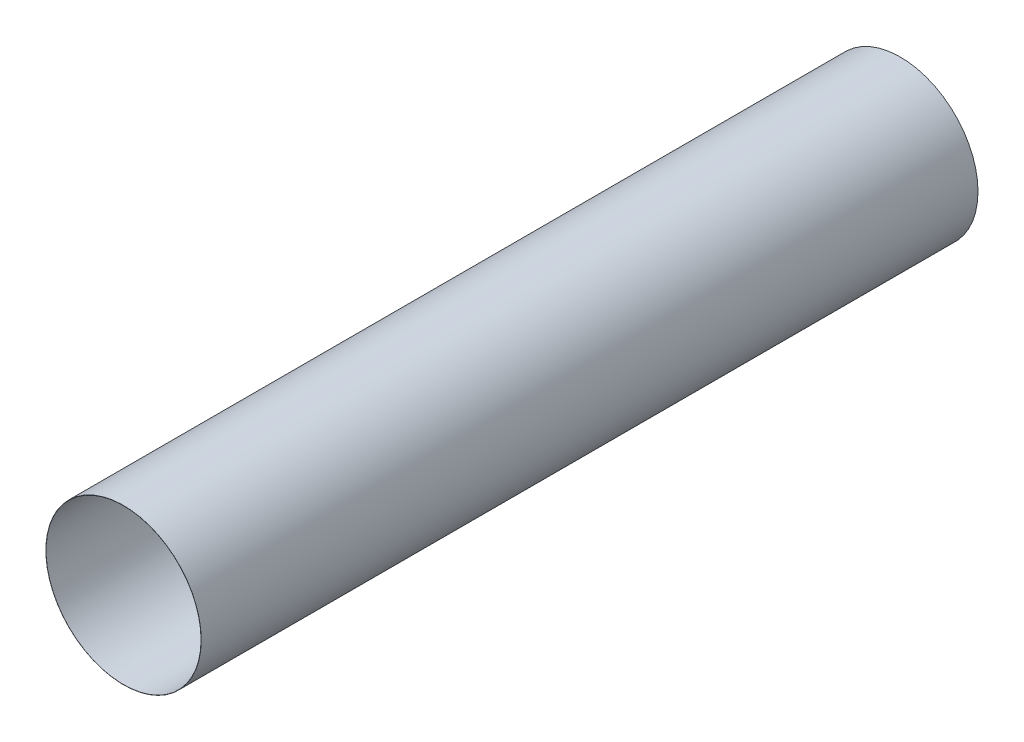
ISO-10303-21;
HEADER;
FILE_DESCRIPTION(('STEP AP214'),'2;1');
FILE_NAME('part.step','',(''),(''),'','','');
FILE_SCHEMA(('AUTOMOTIVE_DESIGN { 1 0 10303 214 1 1 1 1 }'));
ENDSEC;
DATA;
#1=APPLICATION_CONTEXT('core data for automotive mechanical design processes');
#2=APPLICATION_PROTOCOL_DEFINITION('international standard','automotive_design',2000,#1);
#3=PRODUCT_CONTEXT('',#1,'mechanical');
#4=PRODUCT('Part','Part','',(#3));
#5=PRODUCT_RELATED_PRODUCT_CATEGORY('part','',(#4));
#6=PRODUCT_DEFINITION_FORMATION('','',#4);
#7=PRODUCT_DEFINITION_CONTEXT('part definition',#1,'design');
#8=PRODUCT_DEFINITION('design','',#6,#7);
#9=PRODUCT_DEFINITION_SHAPE('','',#8);
#10=(LENGTH_UNIT() NAMED_UNIT(*) SI_UNIT(.MILLI.,.METRE.));
#11=(NAMED_UNIT(*) PLANE_ANGLE_UNIT() SI_UNIT($,.RADIAN.));
#12=(NAMED_UNIT(*) SI_UNIT($,.STERADIAN.) SOLID_ANGLE_UNIT());
#13=UNCERTAINTY_MEASURE_WITH_UNIT(LENGTH_MEASURE(1.E-05),#10,'distance_accuracy_value','');
#14=(GEOMETRIC_REPRESENTATION_CONTEXT(3) GLOBAL_UNCERTAINTY_ASSIGNED_CONTEXT((#13)) GLOBAL_UNIT_ASSIGNED_CONTEXT((#10,
#11,#12)) REPRESENTATION_CONTEXT('',''));
#15=CARTESIAN_POINT('',(0.,0.,0.));
#16=DIRECTION('',(0.,0.,1.));
#17=DIRECTION('',(1.,0.,0.));
#18=AXIS2_PLACEMENT_3D('',#15,#16,#17);
#19=CARTESIAN_POINT('',(0.,0.,10000.));
#20=DIRECTION('',(0.,0.,1.));
#21=DIRECTION('',(1.,0.,0.));
#22=AXIS2_PLACEMENT_3D('',#19,#20,#21);
#23=PLANE('',#22);
#24=CARTESIAN_POINT('',(0.,0.,10000.));
#25=DIRECTION('',(0.,0.,1.));
#26=DIRECTION('',(1.,0.,0.));
#27=AXIS2_PLACEMENT_3D('',#24,#25,#26);
#28=CIRCLE('',#27,1000.);
#29=CARTESIAN_POINT('',(1000.,0.,10000.));
#30=VERTEX_POINT('',#29);
#31=EDGE_CURVE('E10',#30,#30,#28,.T.);
#32=ORIENTED_EDGE('',*,*,#31,.T.);
#33=EDGE_LOOP('',(#32));
#34=FACE_BOUND('',#33,.T.);
#35=CARTESIAN_POINT('',(0.,0.,10000.));
#36=DIRECTION('',(0.,0.,1.));
#37=DIRECTION('',(1.,0.,0.));
#38=AXIS2_PLACEMENT_3D('',#35,#36,#37);
#39=CIRCLE('',#38,998.);
#40=CARTESIAN_POINT('',(998.,0.,10000.));
#41=VERTEX_POINT('',#40);
#42=EDGE_CURVE('E53',#41,#41,#39,.T.);
#43=ORIENTED_EDGE('',*,*,#42,.F.);
#44=EDGE_LOOP('',(#43));
#45=FACE_BOUND('',#44,.T.);
#46=ADVANCED_FACE('F40',(#34,#45),#23,.T.);
#47=CARTESIAN_POINT('',(0.,0.,0.));
#48=DIRECTION('',(0.,0.,1.));
#49=DIRECTION('',(1.,0.,0.));
#50=AXIS2_PLACEMENT_3D('',#47,#48,#49);
#51=PLANE('',#50);
#52=CARTESIAN_POINT('',(0.,0.,0.));
#53=DIRECTION('',(0.,0.,1.));
#54=DIRECTION('',(1.,0.,0.));
#55=AXIS2_PLACEMENT_3D('',#52,#53,#54);
#56=CIRCLE('',#55,1000.);
#57=CARTESIAN_POINT('',(1000.,0.,0.));
#58=VERTEX_POINT('',#57);
#59=EDGE_CURVE('E44',#58,#58,#56,.T.);
#60=ORIENTED_EDGE('',*,*,#59,.F.);
#61=EDGE_LOOP('',(#60));
#62=FACE_BOUND('',#61,.T.);
#63=CARTESIAN_POINT('',(0.,0.,0.));
#64=DIRECTION('',(0.,0.,1.));
#65=DIRECTION('',(1.,0.,0.));
#66=AXIS2_PLACEMENT_3D('',#63,#64,#65);
#67=CIRCLE('',#66,998.);
#68=CARTESIAN_POINT('',(998.,0.,0.));
#69=VERTEX_POINT('',#68);
#70=EDGE_CURVE('E55',#69,#69,#67,.T.);
#71=ORIENTED_EDGE('',*,*,#70,.T.);
#72=EDGE_LOOP('',(#71));
#73=FACE_BOUND('',#72,.T.);
#74=ADVANCED_FACE('F67',(#62,#73),#51,.F.);
#75=CARTESIAN_POINT('',(0.,0.,10000.));
#76=DIRECTION('',(0.,0.,-1.));
#77=DIRECTION('',(-1.,0.,0.));
#78=AXIS2_PLACEMENT_3D('',#75,#76,#77);
#79=CYLINDRICAL_SURFACE('',#78,1000.);
#80=ORIENTED_EDGE('',*,*,#31,.F.);
#81=EDGE_LOOP('',(#80));
#82=FACE_BOUND('',#81,.T.);
#83=ORIENTED_EDGE('',*,*,#59,.T.);
#84=EDGE_LOOP('',(#83));
#85=FACE_BOUND('',#84,.T.);
#86=ADVANCED_FACE('F42',(#82,#85),#79,.T.);
#87=CARTESIAN_POINT('',(0.,0.,10000.));
#88=DIRECTION('',(0.,0.,-1.));
#89=DIRECTION('',(-1.,0.,0.));
#90=AXIS2_PLACEMENT_3D('',#87,#88,#89);
#91=CYLINDRICAL_SURFACE('',#90,998.);
#92=ORIENTED_EDGE('',*,*,#42,.T.);
#93=EDGE_LOOP('',(#92));
#94=FACE_BOUND('',#93,.T.);
#95=ORIENTED_EDGE('',*,*,#70,.F.);
#96=EDGE_LOOP('',(#95));
#97=FACE_BOUND('',#96,.T.);
#98=ADVANCED_FACE('F63',(#94,#97),#91,.F.);
#99=CLOSED_SHELL('',(#46,#74,#86,#98));
#100=MANIFOLD_SOLID_BREP('B2',#99);
#101=ADVANCED_BREP_SHAPE_REPRESENTATION('',(#18,#100),#14);
#102=SHAPE_DEFINITION_REPRESENTATION(#9,#101);
ENDSEC;
END-ISO-10303-21;
